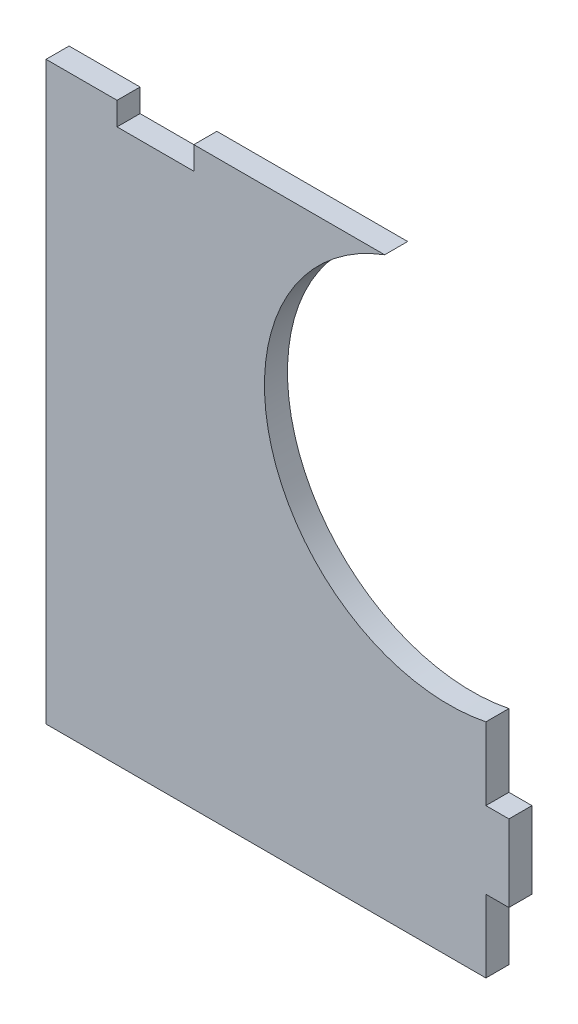
ISO-10303-21;
HEADER;
FILE_DESCRIPTION(('STEP AP214'),'2;1');
FILE_NAME('part.step','',(''),(''),'','','');
FILE_SCHEMA(('AUTOMOTIVE_DESIGN { 1 0 10303 214 1 1 1 1 }'));
ENDSEC;
DATA;
#1=APPLICATION_CONTEXT('core data for automotive mechanical design processes');
#2=APPLICATION_PROTOCOL_DEFINITION('international standard','automotive_design',2000,#1);
#3=PRODUCT_CONTEXT('',#1,'mechanical');
#4=PRODUCT('Part','Part','',(#3));
#5=PRODUCT_RELATED_PRODUCT_CATEGORY('part','',(#4));
#6=PRODUCT_DEFINITION_FORMATION('','',#4);
#7=PRODUCT_DEFINITION_CONTEXT('part definition',#1,'design');
#8=PRODUCT_DEFINITION('design','',#6,#7);
#9=PRODUCT_DEFINITION_SHAPE('','',#8);
#10=(LENGTH_UNIT() NAMED_UNIT(*) SI_UNIT(.MILLI.,.METRE.));
#11=(NAMED_UNIT(*) PLANE_ANGLE_UNIT() SI_UNIT($,.RADIAN.));
#12=(NAMED_UNIT(*) SI_UNIT($,.STERADIAN.) SOLID_ANGLE_UNIT());
#13=UNCERTAINTY_MEASURE_WITH_UNIT(LENGTH_MEASURE(1.E-05),#10,'distance_accuracy_value','');
#14=(GEOMETRIC_REPRESENTATION_CONTEXT(3) GLOBAL_UNCERTAINTY_ASSIGNED_CONTEXT((#13)) GLOBAL_UNIT_ASSIGNED_CONTEXT((#10,
#11,#12)) REPRESENTATION_CONTEXT('',''));
#15=CARTESIAN_POINT('',(0.,0.,0.));
#16=DIRECTION('',(0.,0.,1.));
#17=DIRECTION('',(1.,0.,0.));
#18=AXIS2_PLACEMENT_3D('',#15,#16,#17);
#19=CARTESIAN_POINT('',(-3.,10.2884069599617,3.));
#20=DIRECTION('',(-1.,0.,0.));
#21=DIRECTION('',(0.,0.,1.));
#22=AXIS2_PLACEMENT_3D('',#19,#20,#21);
#23=PLANE('',#22);
#24=DIRECTION('',(0.,1.,0.));
#25=VECTOR('',#24,1.);
#26=CARTESIAN_POINT('',(-3.,10.2884069599617,0.));
#27=LINE('',#26,#25);
#28=CARTESIAN_POINT('',(-3.,0.838406959961723,0.));
#29=VERTEX_POINT('',#28);
#30=CARTESIAN_POINT('',(-3.,10.2884069599617,0.));
#31=VERTEX_POINT('',#30);
#32=EDGE_CURVE('E161',#29,#31,#27,.T.);
#33=ORIENTED_EDGE('',*,*,#32,.T.);
#34=DIRECTION('',(0.,0.,-1.));
#35=VECTOR('',#34,1.);
#36=CARTESIAN_POINT('',(-3.,10.2884069599617,3.));
#37=LINE('',#36,#35);
#38=CARTESIAN_POINT('',(-3.,10.2884069599617,3.));
#39=VERTEX_POINT('',#38);
#40=EDGE_CURVE('E11',#39,#31,#37,.T.);
#41=ORIENTED_EDGE('',*,*,#40,.F.);
#42=DIRECTION('',(0.,1.,0.));
#43=VECTOR('',#42,1.);
#44=CARTESIAN_POINT('',(-3.,10.2884069599617,3.));
#45=LINE('',#44,#43);
#46=CARTESIAN_POINT('',(-3.,0.838406959961723,3.));
#47=VERTEX_POINT('',#46);
#48=EDGE_CURVE('E185',#47,#39,#45,.T.);
#49=ORIENTED_EDGE('',*,*,#48,.F.);
#50=DIRECTION('',(0.,0.,-1.));
#51=VECTOR('',#50,1.);
#52=CARTESIAN_POINT('',(-3.,0.838406959961723,3.));
#53=LINE('',#52,#51);
#54=EDGE_CURVE('E157',#47,#29,#53,.T.);
#55=ORIENTED_EDGE('',*,*,#54,.T.);
#56=EDGE_LOOP('',(#33,#41,#49,#55));
#57=FACE_BOUND('',#56,.T.);
#58=ADVANCED_FACE('F35',(#57),#23,.F.);
#59=CARTESIAN_POINT('',(0.,10.2884069599617,3.));
#60=DIRECTION('',(0.,1.,0.));
#61=DIRECTION('',(-1.,0.,0.));
#62=AXIS2_PLACEMENT_3D('',#59,#60,#61);
#63=PLANE('',#62);
#64=DIRECTION('',(1.,0.,0.));
#65=VECTOR('',#64,1.);
#66=CARTESIAN_POINT('',(0.,10.2884069599617,0.));
#67=LINE('',#66,#65);
#68=CARTESIAN_POINT('',(0.,10.2884069599617,0.));
#69=VERTEX_POINT('',#68);
#70=EDGE_CURVE('E164',#31,#69,#67,.T.);
#71=ORIENTED_EDGE('',*,*,#70,.T.);
#72=DIRECTION('',(0.,0.,-1.));
#73=VECTOR('',#72,1.);
#74=CARTESIAN_POINT('',(0.,10.2884069599617,3.));
#75=LINE('',#74,#73);
#76=CARTESIAN_POINT('',(0.,10.2884069599617,3.));
#77=VERTEX_POINT('',#76);
#78=EDGE_CURVE('E43',#77,#69,#75,.T.);
#79=ORIENTED_EDGE('',*,*,#78,.F.);
#80=DIRECTION('',(1.,0.,0.));
#81=VECTOR('',#80,1.);
#82=CARTESIAN_POINT('',(0.,10.2884069599617,3.));
#83=LINE('',#82,#81);
#84=EDGE_CURVE('E109',#39,#77,#83,.T.);
#85=ORIENTED_EDGE('',*,*,#84,.F.);
#86=ORIENTED_EDGE('',*,*,#40,.T.);
#87=EDGE_LOOP('',(#71,#79,#85,#86));
#88=FACE_BOUND('',#87,.T.);
#89=ADVANCED_FACE('F268',(#88),#63,.F.);
#90=CARTESIAN_POINT('',(0.,20.2884069599617,3.));
#91=DIRECTION('',(-1.,0.,0.));
#92=DIRECTION('',(0.,0.,1.));
#93=AXIS2_PLACEMENT_3D('',#90,#91,#92);
#94=PLANE('',#93);
#95=DIRECTION('',(0.,1.,0.));
#96=VECTOR('',#95,1.);
#97=CARTESIAN_POINT('',(0.,20.2884069599617,0.));
#98=LINE('',#97,#96);
#99=CARTESIAN_POINT('',(0.,20.2884069599617,0.));
#100=VERTEX_POINT('',#99);
#101=EDGE_CURVE('E166',#69,#100,#98,.T.);
#102=ORIENTED_EDGE('',*,*,#101,.T.);
#103=DIRECTION('',(0.,0.,-1.));
#104=VECTOR('',#103,1.);
#105=CARTESIAN_POINT('',(0.,20.2884069599617,3.));
#106=LINE('',#105,#104);
#107=CARTESIAN_POINT('',(0.,20.2884069599617,3.));
#108=VERTEX_POINT('',#107);
#109=EDGE_CURVE('E207',#108,#100,#106,.T.);
#110=ORIENTED_EDGE('',*,*,#109,.F.);
#111=DIRECTION('',(0.,1.,0.));
#112=VECTOR('',#111,1.);
#113=CARTESIAN_POINT('',(0.,20.2884069599617,3.));
#114=LINE('',#113,#112);
#115=EDGE_CURVE('E215',#77,#108,#114,.T.);
#116=ORIENTED_EDGE('',*,*,#115,.F.);
#117=ORIENTED_EDGE('',*,*,#78,.T.);
#118=EDGE_LOOP('',(#102,#110,#116,#117));
#119=FACE_BOUND('',#118,.T.);
#120=ADVANCED_FACE('F213',(#119),#94,.F.);
#121=CARTESIAN_POINT('',(-3.,20.2884069599617,3.));
#122=DIRECTION('',(0.,-1.,0.));
#123=DIRECTION('',(1.,0.,0.));
#124=AXIS2_PLACEMENT_3D('',#121,#122,#123);
#125=PLANE('',#124);
#126=DIRECTION('',(-1.,0.,0.));
#127=VECTOR('',#126,1.);
#128=CARTESIAN_POINT('',(-3.,20.2884069599617,0.));
#129=LINE('',#128,#127);
#130=CARTESIAN_POINT('',(-3.,20.2884069599617,0.));
#131=VERTEX_POINT('',#130);
#132=EDGE_CURVE('E168',#100,#131,#129,.T.);
#133=ORIENTED_EDGE('',*,*,#132,.T.);
#134=DIRECTION('',(0.,0.,-1.));
#135=VECTOR('',#134,1.);
#136=CARTESIAN_POINT('',(-3.,20.2884069599617,3.));
#137=LINE('',#136,#135);
#138=CARTESIAN_POINT('',(-3.,20.2884069599617,3.));
#139=VERTEX_POINT('',#138);
#140=EDGE_CURVE('E204',#139,#131,#137,.T.);
#141=ORIENTED_EDGE('',*,*,#140,.F.);
#142=DIRECTION('',(-1.,0.,0.));
#143=VECTOR('',#142,1.);
#144=CARTESIAN_POINT('',(-3.,20.2884069599617,3.));
#145=LINE('',#144,#143);
#146=EDGE_CURVE('E233',#108,#139,#145,.T.);
#147=ORIENTED_EDGE('',*,*,#146,.F.);
#148=ORIENTED_EDGE('',*,*,#109,.T.);
#149=EDGE_LOOP('',(#133,#141,#147,#148));
#150=FACE_BOUND('',#149,.T.);
#151=ADVANCED_FACE('F224',(#150),#125,.F.);
#152=CARTESIAN_POINT('',(-3.,20.2884069599617,3.));
#153=DIRECTION('',(-1.,0.,0.));
#154=DIRECTION('',(0.,0.,1.));
#155=AXIS2_PLACEMENT_3D('',#152,#153,#154);
#156=PLANE('',#155);
#157=DIRECTION('',(0.,1.,0.));
#158=VECTOR('',#157,1.);
#159=CARTESIAN_POINT('',(-3.,20.2884069599617,0.));
#160=LINE('',#159,#158);
#161=CARTESIAN_POINT('',(-2.99999999999999,29.7384069599617,0.));
#162=VERTEX_POINT('',#161);
#163=EDGE_CURVE('E170',#131,#162,#160,.T.);
#164=ORIENTED_EDGE('',*,*,#163,.T.);
#165=DIRECTION('',(0.,0.,-1.));
#166=VECTOR('',#165,1.);
#167=CARTESIAN_POINT('',(-2.99999999999999,29.7384069599617,3.));
#168=LINE('',#167,#166);
#169=CARTESIAN_POINT('',(-2.99999999999999,29.7384069599617,3.));
#170=VERTEX_POINT('',#169);
#171=EDGE_CURVE('E201',#170,#162,#168,.T.);
#172=ORIENTED_EDGE('',*,*,#171,.F.);
#173=DIRECTION('',(0.,1.,0.));
#174=VECTOR('',#173,1.);
#175=CARTESIAN_POINT('',(-3.,20.2884069599617,3.));
#176=LINE('',#175,#174);
#177=EDGE_CURVE('E230',#139,#170,#176,.T.);
#178=ORIENTED_EDGE('',*,*,#177,.F.);
#179=ORIENTED_EDGE('',*,*,#140,.T.);
#180=EDGE_LOOP('',(#164,#172,#178,#179));
#181=FACE_BOUND('',#180,.T.);
#182=ADVANCED_FACE('F228',(#181),#156,.F.);
#183=CARTESIAN_POINT('',(-7.80000000000001,53.3016069599617,3.));
#184=DIRECTION('',(0.,0.,-1.));
#185=DIRECTION('',(-1.,0.,0.));
#186=AXIS2_PLACEMENT_3D('',#183,#184,#185);
#187=CYLINDRICAL_SURFACE('',#186,24.0471286069668);
#188=CARTESIAN_POINT('',(-7.80000000000001,53.3016069599617,0.));
#189=DIRECTION('',(0.,0.,-1.));
#190=DIRECTION('',(-1.,0.,0.));
#191=AXIS2_PLACEMENT_3D('',#188,#189,#190);
#192=CIRCLE('',#191,24.0471286069668);
#193=CARTESIAN_POINT('',(-16.1879103476372,75.8384069599617,0.));
#194=VERTEX_POINT('',#193);
#195=EDGE_CURVE('E172',#162,#194,#192,.T.);
#196=ORIENTED_EDGE('',*,*,#195,.T.);
#197=DIRECTION('',(0.,0.,-1.));
#198=VECTOR('',#197,1.);
#199=CARTESIAN_POINT('',(-16.1879103476372,75.8384069599617,3.));
#200=LINE('',#199,#198);
#201=CARTESIAN_POINT('',(-16.1879103476372,75.8384069599617,3.));
#202=VERTEX_POINT('',#201);
#203=EDGE_CURVE('E198',#202,#194,#200,.T.);
#204=ORIENTED_EDGE('',*,*,#203,.F.);
#205=CARTESIAN_POINT('',(-7.80000000000001,53.3016069599617,3.));
#206=DIRECTION('',(0.,0.,-1.));
#207=DIRECTION('',(-1.,0.,0.));
#208=AXIS2_PLACEMENT_3D('',#205,#206,#207);
#209=CIRCLE('',#208,24.0471286069668);
#210=EDGE_CURVE('E232',#170,#202,#209,.T.);
#211=ORIENTED_EDGE('',*,*,#210,.F.);
#212=ORIENTED_EDGE('',*,*,#171,.T.);
#213=EDGE_LOOP('',(#196,#204,#211,#212));
#214=FACE_BOUND('',#213,.T.);
#215=ADVANCED_FACE('F281',(#214),#187,.F.);
#216=CARTESIAN_POINT('',(-16.1879103476372,75.8384069599617,3.));
#217=DIRECTION('',(0.,-1.,0.));
#218=DIRECTION('',(0.,0.,-1.));
#219=AXIS2_PLACEMENT_3D('',#216,#217,#218);
#220=PLANE('',#219);
#221=DIRECTION('',(-1.,0.,0.));
#222=VECTOR('',#221,1.);
#223=CARTESIAN_POINT('',(-16.1879103476372,75.8384069599617,0.));
#224=LINE('',#223,#222);
#225=CARTESIAN_POINT('',(-41.05,75.8384069599617,0.));
#226=VERTEX_POINT('',#225);
#227=EDGE_CURVE('E174',#194,#226,#224,.T.);
#228=ORIENTED_EDGE('',*,*,#227,.T.);
#229=DIRECTION('',(0.,0.,-1.));
#230=VECTOR('',#229,1.);
#231=CARTESIAN_POINT('',(-41.05,75.8384069599617,3.));
#232=LINE('',#231,#230);
#233=CARTESIAN_POINT('',(-41.05,75.8384069599617,3.));
#234=VERTEX_POINT('',#233);
#235=EDGE_CURVE('E195',#234,#226,#232,.T.);
#236=ORIENTED_EDGE('',*,*,#235,.F.);
#237=DIRECTION('',(-1.,0.,0.));
#238=VECTOR('',#237,1.);
#239=CARTESIAN_POINT('',(-16.1879103476372,75.8384069599617,3.));
#240=LINE('',#239,#238);
#241=EDGE_CURVE('E235',#202,#234,#240,.T.);
#242=ORIENTED_EDGE('',*,*,#241,.F.);
#243=ORIENTED_EDGE('',*,*,#203,.T.);
#244=EDGE_LOOP('',(#228,#236,#242,#243));
#245=FACE_BOUND('',#244,.T.);
#246=ADVANCED_FACE('F284',(#245),#220,.F.);
#247=CARTESIAN_POINT('',(-41.05,72.8384069599617,3.));
#248=DIRECTION('',(1.,0.,0.));
#249=DIRECTION('',(0.,1.,0.));
#250=AXIS2_PLACEMENT_3D('',#247,#248,#249);
#251=PLANE('',#250);
#252=DIRECTION('',(0.,-1.,0.));
#253=VECTOR('',#252,1.);
#254=CARTESIAN_POINT('',(-41.05,72.8384069599617,0.));
#255=LINE('',#254,#253);
#256=CARTESIAN_POINT('',(-41.05,72.8384069599617,0.));
#257=VERTEX_POINT('',#256);
#258=EDGE_CURVE('E176',#226,#257,#255,.T.);
#259=ORIENTED_EDGE('',*,*,#258,.T.);
#260=DIRECTION('',(0.,0.,-1.));
#261=VECTOR('',#260,1.);
#262=CARTESIAN_POINT('',(-41.05,72.8384069599617,3.));
#263=LINE('',#262,#261);
#264=CARTESIAN_POINT('',(-41.05,72.8384069599617,3.));
#265=VERTEX_POINT('',#264);
#266=EDGE_CURVE('E192',#265,#257,#263,.T.);
#267=ORIENTED_EDGE('',*,*,#266,.F.);
#268=DIRECTION('',(0.,-1.,0.));
#269=VECTOR('',#268,1.);
#270=CARTESIAN_POINT('',(-41.05,72.8384069599617,3.));
#271=LINE('',#270,#269);
#272=EDGE_CURVE('E241',#234,#265,#271,.T.);
#273=ORIENTED_EDGE('',*,*,#272,.F.);
#274=ORIENTED_EDGE('',*,*,#235,.T.);
#275=EDGE_LOOP('',(#259,#267,#273,#274));
#276=FACE_BOUND('',#275,.T.);
#277=ADVANCED_FACE('F288',(#276),#251,.F.);
#278=CARTESIAN_POINT('',(-51.05,72.8384069599617,3.));
#279=DIRECTION('',(0.,-1.,0.));
#280=DIRECTION('',(0.,0.,-1.));
#281=AXIS2_PLACEMENT_3D('',#278,#279,#280);
#282=PLANE('',#281);
#283=DIRECTION('',(-1.,0.,0.));
#284=VECTOR('',#283,1.);
#285=CARTESIAN_POINT('',(-51.05,72.8384069599617,0.));
#286=LINE('',#285,#284);
#287=CARTESIAN_POINT('',(-51.05,72.8384069599617,0.));
#288=VERTEX_POINT('',#287);
#289=EDGE_CURVE('E178',#257,#288,#286,.T.);
#290=ORIENTED_EDGE('',*,*,#289,.T.);
#291=DIRECTION('',(0.,0.,-1.));
#292=VECTOR('',#291,1.);
#293=CARTESIAN_POINT('',(-51.05,72.8384069599617,3.));
#294=LINE('',#293,#292);
#295=CARTESIAN_POINT('',(-51.05,72.8384069599617,3.));
#296=VERTEX_POINT('',#295);
#297=EDGE_CURVE('E189',#296,#288,#294,.T.);
#298=ORIENTED_EDGE('',*,*,#297,.F.);
#299=DIRECTION('',(-1.,0.,0.));
#300=VECTOR('',#299,1.);
#301=CARTESIAN_POINT('',(-51.05,72.8384069599617,3.));
#302=LINE('',#301,#300);
#303=EDGE_CURVE('E243',#265,#296,#302,.T.);
#304=ORIENTED_EDGE('',*,*,#303,.F.);
#305=ORIENTED_EDGE('',*,*,#266,.T.);
#306=EDGE_LOOP('',(#290,#298,#304,#305));
#307=FACE_BOUND('',#306,.T.);
#308=ADVANCED_FACE('F249',(#307),#282,.F.);
#309=CARTESIAN_POINT('',(-51.05,75.8384069599617,3.));
#310=DIRECTION('',(-1.,0.,0.));
#311=DIRECTION('',(0.,-1.,0.));
#312=AXIS2_PLACEMENT_3D('',#309,#310,#311);
#313=PLANE('',#312);
#314=DIRECTION('',(0.,1.,0.));
#315=VECTOR('',#314,1.);
#316=CARTESIAN_POINT('',(-51.05,75.8384069599617,0.));
#317=LINE('',#316,#315);
#318=CARTESIAN_POINT('',(-51.05,75.8384069599617,0.));
#319=VERTEX_POINT('',#318);
#320=EDGE_CURVE('E180',#288,#319,#317,.T.);
#321=ORIENTED_EDGE('',*,*,#320,.T.);
#322=DIRECTION('',(0.,0.,-1.));
#323=VECTOR('',#322,1.);
#324=CARTESIAN_POINT('',(-51.05,75.8384069599617,3.));
#325=LINE('',#324,#323);
#326=CARTESIAN_POINT('',(-51.05,75.8384069599617,3.));
#327=VERTEX_POINT('',#326);
#328=EDGE_CURVE('E152',#327,#319,#325,.T.);
#329=ORIENTED_EDGE('',*,*,#328,.F.);
#330=DIRECTION('',(0.,1.,0.));
#331=VECTOR('',#330,1.);
#332=CARTESIAN_POINT('',(-51.05,75.8384069599617,3.));
#333=LINE('',#332,#331);
#334=EDGE_CURVE('E143',#296,#327,#333,.T.);
#335=ORIENTED_EDGE('',*,*,#334,.F.);
#336=ORIENTED_EDGE('',*,*,#297,.T.);
#337=EDGE_LOOP('',(#321,#329,#335,#336));
#338=FACE_BOUND('',#337,.T.);
#339=ADVANCED_FACE('F253',(#338),#313,.F.);
#340=CARTESIAN_POINT('',(-51.05,75.8384069599617,3.));
#341=DIRECTION('',(0.,-1.,0.));
#342=DIRECTION('',(0.,0.,-1.));
#343=AXIS2_PLACEMENT_3D('',#340,#341,#342);
#344=PLANE('',#343);
#345=DIRECTION('',(-1.,0.,0.));
#346=VECTOR('',#345,1.);
#347=CARTESIAN_POINT('',(-51.05,75.8384069599617,0.));
#348=LINE('',#347,#346);
#349=CARTESIAN_POINT('',(-60.3,75.8384069599617,0.));
#350=VERTEX_POINT('',#349);
#351=EDGE_CURVE('E151',#319,#350,#348,.T.);
#352=ORIENTED_EDGE('',*,*,#351,.T.);
#353=DIRECTION('',(0.,0.,-1.));
#354=VECTOR('',#353,1.);
#355=CARTESIAN_POINT('',(-60.3,75.8384069599617,3.));
#356=LINE('',#355,#354);
#357=CARTESIAN_POINT('',(-60.3,75.8384069599617,3.));
#358=VERTEX_POINT('',#357);
#359=EDGE_CURVE('E148',#358,#350,#356,.T.);
#360=ORIENTED_EDGE('',*,*,#359,.F.);
#361=DIRECTION('',(-1.,0.,0.));
#362=VECTOR('',#361,1.);
#363=CARTESIAN_POINT('',(-51.05,75.8384069599617,3.));
#364=LINE('',#363,#362);
#365=EDGE_CURVE('E137',#327,#358,#364,.T.);
#366=ORIENTED_EDGE('',*,*,#365,.F.);
#367=ORIENTED_EDGE('',*,*,#328,.T.);
#368=EDGE_LOOP('',(#352,#360,#366,#367));
#369=FACE_BOUND('',#368,.T.);
#370=ADVANCED_FACE('F149',(#369),#344,.F.);
#371=CARTESIAN_POINT('',(-60.3,0.838406959961716,3.));
#372=DIRECTION('',(1.,0.,0.));
#373=DIRECTION('',(0.,0.,-1.));
#374=AXIS2_PLACEMENT_3D('',#371,#372,#373);
#375=PLANE('',#374);
#376=DIRECTION('',(0.,-1.,0.));
#377=VECTOR('',#376,1.);
#378=CARTESIAN_POINT('',(-60.3,0.838406959961716,0.));
#379=LINE('',#378,#377);
#380=CARTESIAN_POINT('',(-60.3,0.838406959961716,0.));
#381=VERTEX_POINT('',#380);
#382=EDGE_CURVE('E95',#350,#381,#379,.T.);
#383=ORIENTED_EDGE('',*,*,#382,.T.);
#384=DIRECTION('',(0.,0.,-1.));
#385=VECTOR('',#384,1.);
#386=CARTESIAN_POINT('',(-60.3,0.838406959961716,3.));
#387=LINE('',#386,#385);
#388=CARTESIAN_POINT('',(-60.3,0.838406959961716,3.));
#389=VERTEX_POINT('',#388);
#390=EDGE_CURVE('E153',#389,#381,#387,.T.);
#391=ORIENTED_EDGE('',*,*,#390,.F.);
#392=DIRECTION('',(0.,-1.,0.));
#393=VECTOR('',#392,1.);
#394=CARTESIAN_POINT('',(-60.3,0.838406959961716,3.));
#395=LINE('',#394,#393);
#396=EDGE_CURVE('E141',#358,#389,#395,.T.);
#397=ORIENTED_EDGE('',*,*,#396,.F.);
#398=ORIENTED_EDGE('',*,*,#359,.T.);
#399=EDGE_LOOP('',(#383,#391,#397,#398));
#400=FACE_BOUND('',#399,.T.);
#401=ADVANCED_FACE('F155',(#400),#375,.F.);
#402=CARTESIAN_POINT('',(-3.,0.838406959961723,3.));
#403=DIRECTION('',(0.,1.,0.));
#404=DIRECTION('',(-1.,0.,0.));
#405=AXIS2_PLACEMENT_3D('',#402,#403,#404);
#406=PLANE('',#405);
#407=DIRECTION('',(1.,0.,0.));
#408=VECTOR('',#407,1.);
#409=CARTESIAN_POINT('',(-3.,0.838406959961723,0.));
#410=LINE('',#409,#408);
#411=EDGE_CURVE('E101',#381,#29,#410,.T.);
#412=ORIENTED_EDGE('',*,*,#411,.T.);
#413=ORIENTED_EDGE('',*,*,#54,.F.);
#414=DIRECTION('',(1.,0.,0.));
#415=VECTOR('',#414,1.);
#416=CARTESIAN_POINT('',(-3.,0.838406959961723,3.));
#417=LINE('',#416,#415);
#418=EDGE_CURVE('E51',#389,#47,#417,.T.);
#419=ORIENTED_EDGE('',*,*,#418,.F.);
#420=ORIENTED_EDGE('',*,*,#390,.T.);
#421=EDGE_LOOP('',(#412,#413,#419,#420));
#422=FACE_BOUND('',#421,.T.);
#423=ADVANCED_FACE('F257',(#422),#406,.F.);
#424=CARTESIAN_POINT('',(-7.80000000000001,53.3016069599617,3.));
#425=DIRECTION('',(0.,0.,-1.));
#426=DIRECTION('',(-1.,0.,0.));
#427=AXIS2_PLACEMENT_3D('',#424,#425,#426);
#428=PLANE('',#427);
#429=ORIENTED_EDGE('',*,*,#48,.T.);
#430=ORIENTED_EDGE('',*,*,#84,.T.);
#431=ORIENTED_EDGE('',*,*,#115,.T.);
#432=ORIENTED_EDGE('',*,*,#146,.T.);
#433=ORIENTED_EDGE('',*,*,#177,.T.);
#434=ORIENTED_EDGE('',*,*,#210,.T.);
#435=ORIENTED_EDGE('',*,*,#241,.T.);
#436=ORIENTED_EDGE('',*,*,#272,.T.);
#437=ORIENTED_EDGE('',*,*,#303,.T.);
#438=ORIENTED_EDGE('',*,*,#334,.T.);
#439=ORIENTED_EDGE('',*,*,#365,.T.);
#440=ORIENTED_EDGE('',*,*,#396,.T.);
#441=ORIENTED_EDGE('',*,*,#418,.T.);
#442=EDGE_LOOP('',(#429,#430,#431,#432,#433,#434,#435,#436,#437,#438,#439,#440,#441));
#443=FACE_BOUND('',#442,.T.);
#444=ADVANCED_FACE('F139',(#443),#428,.F.);
#445=CARTESIAN_POINT('',(-7.80000000000001,53.3016069599617,0.));
#446=DIRECTION('',(0.,0.,-1.));
#447=DIRECTION('',(-1.,0.,0.));
#448=AXIS2_PLACEMENT_3D('',#445,#446,#447);
#449=PLANE('',#448);
#450=ORIENTED_EDGE('',*,*,#32,.F.);
#451=ORIENTED_EDGE('',*,*,#411,.F.);
#452=ORIENTED_EDGE('',*,*,#382,.F.);
#453=ORIENTED_EDGE('',*,*,#351,.F.);
#454=ORIENTED_EDGE('',*,*,#320,.F.);
#455=ORIENTED_EDGE('',*,*,#289,.F.);
#456=ORIENTED_EDGE('',*,*,#258,.F.);
#457=ORIENTED_EDGE('',*,*,#227,.F.);
#458=ORIENTED_EDGE('',*,*,#195,.F.);
#459=ORIENTED_EDGE('',*,*,#163,.F.);
#460=ORIENTED_EDGE('',*,*,#132,.F.);
#461=ORIENTED_EDGE('',*,*,#101,.F.);
#462=ORIENTED_EDGE('',*,*,#70,.F.);
#463=EDGE_LOOP('',(#450,#451,#452,#453,#454,#455,#456,#457,#458,#459,#460,#461,#462));
#464=FACE_BOUND('',#463,.T.);
#465=ADVANCED_FACE('F219',(#464),#449,.T.);
#466=CLOSED_SHELL('',(#58,#89,#120,#151,#182,#215,#246,#277,#308,#339,#370,#401,#423,#444,#465));
#467=MANIFOLD_SOLID_BREP('B2',#466);
#468=ADVANCED_BREP_SHAPE_REPRESENTATION('',(#18,#467),#14);
#469=SHAPE_DEFINITION_REPRESENTATION(#9,#468);
ENDSEC;
END-ISO-10303-21;
